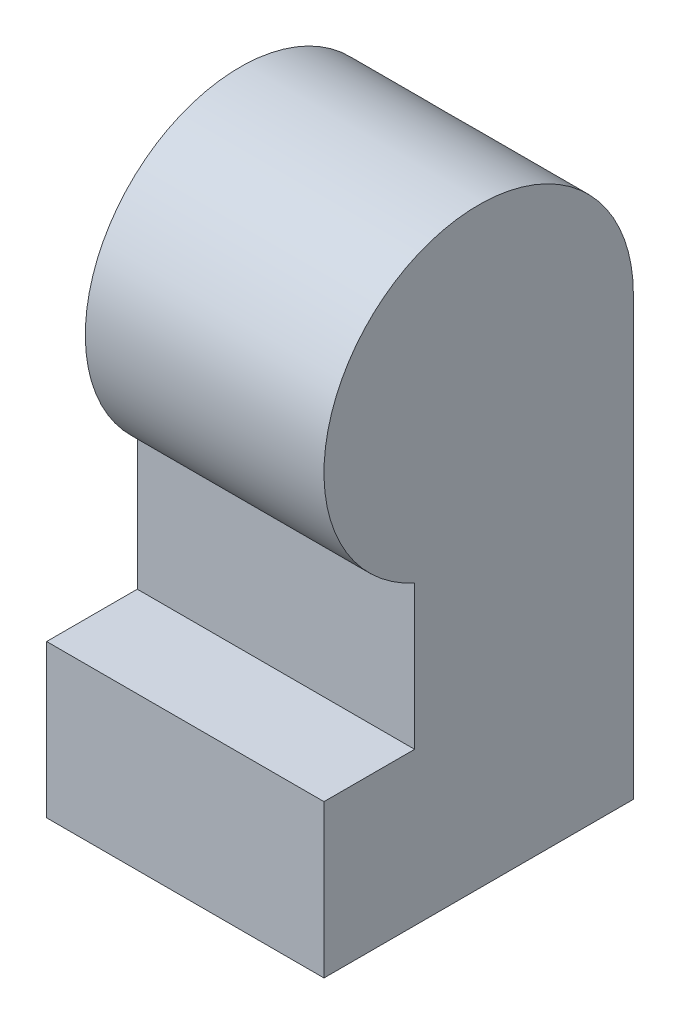
ISO-10303-21;
HEADER;
FILE_DESCRIPTION(('STEP AP214'),'2;1');
FILE_NAME('part.step','',(''),(''),'','','');
FILE_SCHEMA(('AUTOMOTIVE_DESIGN { 1 0 10303 214 1 1 1 1 }'));
ENDSEC;
DATA;
#1=APPLICATION_CONTEXT('core data for automotive mechanical design processes');
#2=APPLICATION_PROTOCOL_DEFINITION('international standard','automotive_design',2000,#1);
#3=PRODUCT_CONTEXT('',#1,'mechanical');
#4=PRODUCT('Part','Part','',(#3));
#5=PRODUCT_RELATED_PRODUCT_CATEGORY('part','',(#4));
#6=PRODUCT_DEFINITION_FORMATION('','',#4);
#7=PRODUCT_DEFINITION_CONTEXT('part definition',#1,'design');
#8=PRODUCT_DEFINITION('design','',#6,#7);
#9=PRODUCT_DEFINITION_SHAPE('','',#8);
#10=(LENGTH_UNIT() NAMED_UNIT(*) SI_UNIT(.MILLI.,.METRE.));
#11=(NAMED_UNIT(*) PLANE_ANGLE_UNIT() SI_UNIT($,.RADIAN.));
#12=(NAMED_UNIT(*) SI_UNIT($,.STERADIAN.) SOLID_ANGLE_UNIT());
#13=UNCERTAINTY_MEASURE_WITH_UNIT(LENGTH_MEASURE(1.E-05),#10,'distance_accuracy_value','');
#14=(GEOMETRIC_REPRESENTATION_CONTEXT(3) GLOBAL_UNCERTAINTY_ASSIGNED_CONTEXT((#13)) GLOBAL_UNIT_ASSIGNED_CONTEXT((#10,
#11,#12)) REPRESENTATION_CONTEXT('',''));
#15=CARTESIAN_POINT('',(0.,0.,0.));
#16=DIRECTION('',(0.,0.,1.));
#17=DIRECTION('',(1.,0.,0.));
#18=AXIS2_PLACEMENT_3D('',#15,#16,#17);
#19=CARTESIAN_POINT('',(-3.55,0.500000000000001,-2.16));
#20=DIRECTION('',(0.,0.,-1.));
#21=DIRECTION('',(0.,1.,0.));
#22=AXIS2_PLACEMENT_3D('',#19,#20,#21);
#23=PLANE('',#22);
#24=DIRECTION('',(0.,1.,0.));
#25=VECTOR('',#24,1.);
#26=CARTESIAN_POINT('',(-4.55589256539026,0.,-2.16));
#27=LINE('',#26,#25);
#28=CARTESIAN_POINT('',(-4.55589256539026,-1.67903192883735,-2.16));
#29=VERTEX_POINT('',#28);
#30=CARTESIAN_POINT('',(-4.55589256539026,2.2,-2.16));
#31=VERTEX_POINT('',#30);
#32=EDGE_CURVE('E167',#29,#31,#27,.T.);
#33=ORIENTED_EDGE('',*,*,#32,.F.);
#34=CARTESIAN_POINT('',(-3.55,0.500000000000001,-2.16));
#35=DIRECTION('',(0.,0.,-1.));
#36=DIRECTION('',(0.,1.,0.));
#37=AXIS2_PLACEMENT_3D('',#34,#35,#36);
#38=CIRCLE('',#37,2.4);
#39=CARTESIAN_POINT('',(-1.85589256539026,2.2,-2.16));
#40=VERTEX_POINT('',#39);
#41=EDGE_CURVE('E183',#29,#40,#38,.T.);
#42=ORIENTED_EDGE('',*,*,#41,.T.);
#43=DIRECTION('',(1.,0.,0.));
#44=VECTOR('',#43,1.);
#45=CARTESIAN_POINT('',(0.,2.2,-2.16));
#46=LINE('',#45,#44);
#47=EDGE_CURVE('E55',#31,#40,#46,.T.);
#48=ORIENTED_EDGE('',*,*,#47,.F.);
#49=EDGE_LOOP('',(#33,#42,#48));
#50=FACE_BOUND('',#49,.T.);
#51=ADVANCED_FACE('F37',(#50),#23,.T.);
#52=CARTESIAN_POINT('',(-7.1,-11.2,0.));
#53=DIRECTION('',(0.,1.,0.));
#54=DIRECTION('',(0.,0.,1.));
#55=AXIS2_PLACEMENT_3D('',#52,#53,#54);
#56=PLANE('',#55);
#57=DIRECTION('',(0.,0.,1.));
#58=VECTOR('',#57,1.);
#59=CARTESIAN_POINT('',(0.,-11.2,0.));
#60=LINE('',#59,#58);
#61=CARTESIAN_POINT('',(0.,-11.2,-3.96));
#62=VERTEX_POINT('',#61);
#63=CARTESIAN_POINT('',(0.,-11.2,3.96));
#64=VERTEX_POINT('',#63);
#65=EDGE_CURVE('E300',#62,#64,#60,.T.);
#66=ORIENTED_EDGE('',*,*,#65,.T.);
#67=DIRECTION('',(1.,0.,0.));
#68=VECTOR('',#67,1.);
#69=CARTESIAN_POINT('',(-7.1,-11.2,3.96));
#70=LINE('',#69,#68);
#71=CARTESIAN_POINT('',(-7.1,-11.2,3.96));
#72=VERTEX_POINT('',#71);
#73=EDGE_CURVE('E312',#72,#64,#70,.T.);
#74=ORIENTED_EDGE('',*,*,#73,.F.);
#75=DIRECTION('',(0.,0.,1.));
#76=VECTOR('',#75,1.);
#77=CARTESIAN_POINT('',(-7.1,-11.2,0.));
#78=LINE('',#77,#76);
#79=CARTESIAN_POINT('',(-7.1,-11.2,-3.96));
#80=VERTEX_POINT('',#79);
#81=EDGE_CURVE('E290',#80,#72,#78,.T.);
#82=ORIENTED_EDGE('',*,*,#81,.F.);
#83=DIRECTION('',(1.,0.,0.));
#84=VECTOR('',#83,1.);
#85=CARTESIAN_POINT('',(-7.1,-11.2,-3.96));
#86=LINE('',#85,#84);
#87=EDGE_CURVE('E309',#80,#62,#86,.T.);
#88=ORIENTED_EDGE('',*,*,#87,.T.);
#89=EDGE_LOOP('',(#66,#74,#82,#88));
#90=FACE_BOUND('',#89,.T.);
#91=DIRECTION('',(0.,0.,1.));
#92=VECTOR('',#91,1.);
#93=CARTESIAN_POINT('',(-6.05,-11.2,0.));
#94=LINE('',#93,#92);
#95=CARTESIAN_POINT('',(-6.05,-11.2,-2.44));
#96=VERTEX_POINT('',#95);
#97=CARTESIAN_POINT('',(-6.05,-11.2,2.56));
#98=VERTEX_POINT('',#97);
#99=EDGE_CURVE('E257',#96,#98,#94,.T.);
#100=ORIENTED_EDGE('',*,*,#99,.T.);
#101=DIRECTION('',(1.,0.,0.));
#102=VECTOR('',#101,1.);
#103=CARTESIAN_POINT('',(0.,-11.2,2.56));
#104=LINE('',#103,#102);
#105=CARTESIAN_POINT('',(-1.05,-11.2,2.56));
#106=VERTEX_POINT('',#105);
#107=EDGE_CURVE('E232',#98,#106,#104,.T.);
#108=ORIENTED_EDGE('',*,*,#107,.T.);
#109=DIRECTION('',(0.,0.,1.));
#110=VECTOR('',#109,1.);
#111=CARTESIAN_POINT('',(-1.05,-11.2,0.));
#112=LINE('',#111,#110);
#113=CARTESIAN_POINT('',(-1.05,-11.2,-2.44));
#114=VERTEX_POINT('',#113);
#115=EDGE_CURVE('E266',#114,#106,#112,.T.);
#116=ORIENTED_EDGE('',*,*,#115,.F.);
#117=DIRECTION('',(1.,0.,0.));
#118=VECTOR('',#117,1.);
#119=CARTESIAN_POINT('',(0.,-11.2,-2.44));
#120=LINE('',#119,#118);
#121=EDGE_CURVE('E250',#96,#114,#120,.T.);
#122=ORIENTED_EDGE('',*,*,#121,.F.);
#123=EDGE_LOOP('',(#100,#108,#116,#122));
#124=FACE_BOUND('',#123,.T.);
#125=ADVANCED_FACE('F359',(#90,#124),#56,.F.);
#126=CARTESIAN_POINT('',(0.,-2.2,0.860000000000003));
#127=DIRECTION('',(0.,0.,-1.));
#128=DIRECTION('',(0.,1.,0.));
#129=AXIS2_PLACEMENT_3D('',#126,#127,#128);
#130=PLANE('',#129);
#131=DIRECTION('',(0.,-1.,0.));
#132=VECTOR('',#131,1.);
#133=CARTESIAN_POINT('',(-1.05,-2.2,0.860000000000003));
#134=LINE('',#133,#132);
#135=CARTESIAN_POINT('',(-1.05,-2.2,0.860000000000003));
#136=VERTEX_POINT('',#135);
#137=CARTESIAN_POINT('',(-1.05,-9.2,0.86));
#138=VERTEX_POINT('',#137);
#139=EDGE_CURVE('E275',#136,#138,#134,.T.);
#140=ORIENTED_EDGE('',*,*,#139,.T.);
#141=DIRECTION('',(1.,0.,0.));
#142=VECTOR('',#141,1.);
#143=CARTESIAN_POINT('',(0.,-9.2,0.86));
#144=LINE('',#143,#142);
#145=CARTESIAN_POINT('',(-6.05,-9.2,0.86));
#146=VERTEX_POINT('',#145);
#147=EDGE_CURVE('E235',#146,#138,#144,.T.);
#148=ORIENTED_EDGE('',*,*,#147,.F.);
#149=DIRECTION('',(0.,-1.,0.));
#150=VECTOR('',#149,1.);
#151=CARTESIAN_POINT('',(-6.05,-2.2,0.860000000000003));
#152=LINE('',#151,#150);
#153=CARTESIAN_POINT('',(-6.05,-2.2,0.860000000000003));
#154=VERTEX_POINT('',#153);
#155=EDGE_CURVE('E272',#154,#146,#152,.T.);
#156=ORIENTED_EDGE('',*,*,#155,.F.);
#157=DIRECTION('',(1.,0.,0.));
#158=VECTOR('',#157,1.);
#159=CARTESIAN_POINT('',(0.,-2.2,0.860000000000003));
#160=LINE('',#159,#158);
#161=EDGE_CURVE('E260',#154,#136,#160,.T.);
#162=ORIENTED_EDGE('',*,*,#161,.T.);
#163=EDGE_LOOP('',(#140,#148,#156,#162));
#164=FACE_BOUND('',#163,.T.);
#165=ADVANCED_FACE('F355',(#164),#130,.T.);
#166=CARTESIAN_POINT('',(-6.11,0.,0.));
#167=DIRECTION('',(1.,0.,0.));
#168=DIRECTION('',(0.,0.,-1.));
#169=AXIS2_PLACEMENT_3D('',#166,#167,#168);
#170=CYLINDRICAL_SURFACE('',#169,3.96);
#171=CARTESIAN_POINT('',(-5.8973389188611,0.,-3.96));
#172=CARTESIAN_POINT('',(-5.9098768045997,0.0588098476344911,-3.96001142593905));
#173=CARTESIAN_POINT('',(-5.92018341682147,0.118093657570129,-3.95869019521766));
#174=CARTESIAN_POINT('',(-5.93631386333854,0.237132249716932,-3.95333954227172));
#175=CARTESIAN_POINT('',(-5.94213878937538,0.296886913642394,-3.94931078005181));
#176=CARTESIAN_POINT('',(-5.94927422380176,0.416126318528774,-3.93852873281473));
#177=CARTESIAN_POINT('',(-5.95060672792668,0.475610946343613,-3.93178890395762));
#178=CARTESIAN_POINT('',(-5.94888651826898,0.594135593670603,-3.91563375193332));
#179=CARTESIAN_POINT('',(-5.94583378633173,0.653175611341073,-3.90621841768981));
#180=CARTESIAN_POINT('',(-5.93025155531583,0.828925244732238,-3.87409364483853));
#181=CARTESIAN_POINT('',(-5.91130745177118,0.944432544806918,-3.84749006070398));
#182=CARTESIAN_POINT('',(-5.85772761796128,1.16917043555267,-3.78527369433188));
#183=CARTESIAN_POINT('',(-5.8230780383701,1.27839539035702,-3.74965297291276));
#184=CARTESIAN_POINT('',(-5.73761295272431,1.49425016981526,-3.66916579475425));
#185=CARTESIAN_POINT('',(-5.68603087006467,1.600427521711,-3.6239062648844));
#186=CARTESIAN_POINT('',(-5.56931231141499,1.80230489726493,-3.5278635948155));
#187=CARTESIAN_POINT('',(-5.50416685193552,1.89799791234954,-3.47707680441677));
#188=CARTESIAN_POINT('',(-5.34957245886429,2.09362962423809,-3.36350987524217));
#189=CARTESIAN_POINT('',(-5.25787033292367,2.19146366776133,-3.30017010799465));
#190=CARTESIAN_POINT('',(-5.05934205299709,2.37077502192629,-3.17380688668942));
#191=CARTESIAN_POINT('',(-4.95250717585149,2.45224283241339,-3.11078363693562));
#192=CARTESIAN_POINT('',(-4.7409667801253,2.58685104236652,-2.99938155865773));
#193=CARTESIAN_POINT('',(-4.63821091870957,2.64238802790115,-2.95020589897878));
#194=CARTESIAN_POINT('',(-4.42247423572761,2.73890332623159,-2.86082700044125));
#195=CARTESIAN_POINT('',(-4.30951430356272,2.77991057258228,-2.82060598996435));
#196=CARTESIAN_POINT('',(-4.1013322354483,2.83771311514811,-2.76229683493894));
#197=CARTESIAN_POINT('',(-4.00789408464479,2.85788974702369,-2.74125826621285));
#198=CARTESIAN_POINT('',(-3.81748707233872,2.88698351380043,-2.71060665968518));
#199=CARTESIAN_POINT('',(-3.72052353379835,2.89591695310912,-2.70097707823892));
#200=CARTESIAN_POINT('',(-3.52546248608665,2.90186254803494,-2.69459081598645));
#201=CARTESIAN_POINT('',(-3.42736228959246,2.89883523816319,-2.69787675081828));
#202=CARTESIAN_POINT('',(-3.23343630798544,2.88102900506134,-2.71687802631694));
#203=CARTESIAN_POINT('',(-3.13761312723622,2.86623723509869,-2.73260695457104));
#204=CARTESIAN_POINT('',(-2.92975894803342,2.82142079932598,-2.77892465677919));
#205=CARTESIAN_POINT('',(-2.81888224028076,2.788733657656,-2.81204600983547));
#206=CARTESIAN_POINT('',(-2.6059445652736,2.70946542950508,-2.88849841631796));
#207=CARTESIAN_POINT('',(-2.50390426441123,2.66285284931629,-2.93185256502377));
#208=CARTESIAN_POINT('',(-2.27709902374816,2.53995512114047,-3.03955495311265));
#209=CARTESIAN_POINT('',(-2.15594373839769,2.45895405274907,-3.10611055664989));
#210=CARTESIAN_POINT('',(-1.93079904919403,2.27739188823978,-3.24159983532997));
#211=CARTESIAN_POINT('',(-1.8268270546934,2.17681117680889,-3.31053583775859));
#212=CARTESIAN_POINT('',(-1.63658263891038,1.95611284262852,-3.44559774988512));
#213=CARTESIAN_POINT('',(-1.55050594124501,1.83580256142536,-3.51168689249093));
#214=CARTESIAN_POINT('',(-1.40058775471337,1.57802776944039,-3.6347921620675));
#215=CARTESIAN_POINT('',(-1.33669922855404,1.44060039698618,-3.69182734158396));
#216=CARTESIAN_POINT('',(-1.24710880306369,1.185841078758,-3.78008582227689));
#217=CARTESIAN_POINT('',(-1.21595137357599,1.07143094712434,-3.81422384051125));
#218=CARTESIAN_POINT('',(-1.17077055375075,0.836869622338844,-3.87243922554983));
#219=CARTESIAN_POINT('',(-1.15672341538163,0.716726627441237,-3.89653050597589));
#220=CARTESIAN_POINT('',(-1.14796091855799,0.496462619761133,-3.93003193715653));
#221=CARTESIAN_POINT('',(-1.1501498561578,0.396749586351458,-3.94133360872308));
#222=CARTESIAN_POINT('',(-1.16279625724436,0.247475692136995,-3.95257702124407));
#223=CARTESIAN_POINT('',(-1.16858866843412,0.1976892867594,-3.95537318999956));
#224=CARTESIAN_POINT('',(-1.1832910997067,0.0984966293703381,-3.95908660870838));
#225=CARTESIAN_POINT('',(-1.19220182296081,0.0490904656726238,-3.96000343455474));
#226=CARTESIAN_POINT('',(-1.2026610811389,0.,-3.96));
#227=B_SPLINE_CURVE_WITH_KNOTS('',3,(#171,#172,#173,#174,#175,#176,#177,#178,#179,#180,#181,
#182,#183,#184,#185,#186,#187,#188,#189,#190,#191,#192,#193,#194,#195,#196,#197,#198,#199,#200,
#201,#202,#203,#204,#205,#206,#207,#208,#209,#210,#211,#212,#213,#214,#215,#216,#217,#218,#219,
#220,#221,#222,#223,#224,#225,#226),.UNSPECIFIED.,.F.,.F.,(4,2,2,2,2,2,2,2,2,2,2,2,2,2,2,2,2,2,
2,2,2,2,2,2,2,2,2,4),(0.,0.180333838130227,0.360623732903945,0.540029602680359,0.71943621518971,
1.07774884073325,1.43637804831797,1.8142191198507,2.19231124917077,2.63548700254101,
3.07891926878974,3.45786648324535,3.83605478938871,4.12850999606934,4.42054060592625,
4.71353559853178,5.00685098024452,5.36561374202811,5.72519410272783,6.20340855129301,
6.68210457423695,7.16578873405516,7.64844116868891,8.01707795939269,8.38520251975802,
8.6852217452333,8.83570331326087,8.98621883638002),.UNSPECIFIED.);
#228=CARTESIAN_POINT('',(-5.8973389188611,0.,-3.96));
#229=VERTEX_POINT('',#228);
#230=CARTESIAN_POINT('',(-1.2026610811389,0.,-3.96));
#231=VERTEX_POINT('',#230);
#232=EDGE_CURVE('E62',#229,#231,#227,.T.);
#233=ORIENTED_EDGE('',*,*,#232,.F.);
#234=DIRECTION('',(1.,0.,0.));
#235=VECTOR('',#234,1.);
#236=CARTESIAN_POINT('',(-7.1,0.,-3.96));
#237=LINE('',#236,#235);
#238=CARTESIAN_POINT('',(-6.11,0.,-3.96));
#239=VERTEX_POINT('',#238);
#240=EDGE_CURVE('E307',#239,#229,#237,.T.);
#241=ORIENTED_EDGE('',*,*,#240,.F.);
#242=CARTESIAN_POINT('',(-6.11,0.,0.));
#243=DIRECTION('',(1.,0.,0.));
#244=DIRECTION('',(0.,0.,-1.));
#245=AXIS2_PLACEMENT_3D('',#242,#243,#244);
#246=CIRCLE('',#245,3.96);
#247=CARTESIAN_POINT('',(-6.11,-3.60444170434202,1.64));
#248=VERTEX_POINT('',#247);
#249=EDGE_CURVE('E12',#239,#248,#246,.T.);
#250=ORIENTED_EDGE('',*,*,#249,.T.);
#251=DIRECTION('',(1.,0.,0.));
#252=VECTOR('',#251,1.);
#253=CARTESIAN_POINT('',(-7.1,-3.60444170434202,1.64));
#254=LINE('',#253,#252);
#255=CARTESIAN_POINT('',(0.,-3.60444170434202,1.64));
#256=VERTEX_POINT('',#255);
#257=EDGE_CURVE('E294',#248,#256,#254,.T.);
#258=ORIENTED_EDGE('',*,*,#257,.T.);
#259=CARTESIAN_POINT('',(0.,0.,0.));
#260=DIRECTION('',(1.,0.,0.));
#261=DIRECTION('',(0.,0.,-1.));
#262=AXIS2_PLACEMENT_3D('',#259,#260,#261);
#263=CIRCLE('',#262,3.96);
#264=CARTESIAN_POINT('',(0.,0.,-3.96));
#265=VERTEX_POINT('',#264);
#266=EDGE_CURVE('E47',#265,#256,#263,.T.);
#267=ORIENTED_EDGE('',*,*,#266,.F.);
#268=EDGE_CURVE('E308',#231,#265,#237,.T.);
#269=ORIENTED_EDGE('',*,*,#268,.F.);
#270=EDGE_LOOP('',(#233,#241,#250,#258,#267,#269));
#271=FACE_BOUND('',#270,.T.);
#272=ADVANCED_FACE('F39',(#271),#170,.T.);
#273=CARTESIAN_POINT('',(-6.11,0.,0.));
#274=DIRECTION('',(1.,0.,0.));
#275=DIRECTION('',(0.,0.,-1.));
#276=AXIS2_PLACEMENT_3D('',#273,#274,#275);
#277=PLANE('',#276);
#278=CARTESIAN_POINT('',(-6.11,0.,0.));
#279=DIRECTION('',(-1.,0.,0.));
#280=DIRECTION('',(0.,0.,1.));
#281=AXIS2_PLACEMENT_3D('',#278,#279,#280);
#282=CIRCLE('',#281,1.125);
#283=CARTESIAN_POINT('',(-6.11,0.,1.125));
#284=VERTEX_POINT('',#283);
#285=EDGE_CURVE('E185',#284,#284,#282,.T.);
#286=ORIENTED_EDGE('',*,*,#285,.F.);
#287=EDGE_LOOP('',(#286));
#288=FACE_BOUND('',#287,.T.);
#289=ORIENTED_EDGE('',*,*,#249,.F.);
#290=CARTESIAN_POINT('',(-6.11,0.,0.));
#291=DIRECTION('',(1.,0.,0.));
#292=DIRECTION('',(0.,0.,-1.));
#293=AXIS2_PLACEMENT_3D('',#290,#291,#292);
#294=CIRCLE('',#293,3.96);
#295=EDGE_CURVE('E306',#248,#239,#294,.T.);
#296=ORIENTED_EDGE('',*,*,#295,.F.);
#297=EDGE_LOOP('',(#289,#296));
#298=FACE_BOUND('',#297,.T.);
#299=ADVANCED_FACE('F347',(#288,#298),#277,.F.);
#300=CARTESIAN_POINT('',(0.,0.,0.));
#301=DIRECTION('',(1.,0.,0.));
#302=DIRECTION('',(0.,0.,-1.));
#303=AXIS2_PLACEMENT_3D('',#300,#301,#302);
#304=PLANE('',#303);
#305=ORIENTED_EDGE('',*,*,#266,.T.);
#306=DIRECTION('',(0.,1.,0.));
#307=VECTOR('',#306,1.);
#308=CARTESIAN_POINT('',(0.,0.,1.64));
#309=LINE('',#308,#307);
#310=CARTESIAN_POINT('',(0.,-7.29,1.64));
#311=VERTEX_POINT('',#310);
#312=EDGE_CURVE('E271',#311,#256,#309,.T.);
#313=ORIENTED_EDGE('',*,*,#312,.F.);
#314=DIRECTION('',(0.,0.,-1.));
#315=VECTOR('',#314,1.);
#316=CARTESIAN_POINT('',(0.,-7.29,0.));
#317=LINE('',#316,#315);
#318=CARTESIAN_POINT('',(0.,-7.29,3.96));
#319=VERTEX_POINT('',#318);
#320=EDGE_CURVE('E296',#319,#311,#317,.T.);
#321=ORIENTED_EDGE('',*,*,#320,.F.);
#322=DIRECTION('',(0.,1.,0.));
#323=VECTOR('',#322,1.);
#324=CARTESIAN_POINT('',(0.,0.,3.96));
#325=LINE('',#324,#323);
#326=EDGE_CURVE('E298',#64,#319,#325,.T.);
#327=ORIENTED_EDGE('',*,*,#326,.F.);
#328=ORIENTED_EDGE('',*,*,#65,.F.);
#329=DIRECTION('',(0.,-1.,0.));
#330=VECTOR('',#329,1.);
#331=CARTESIAN_POINT('',(0.,0.,-3.96));
#332=LINE('',#331,#330);
#333=EDGE_CURVE('E284',#265,#62,#332,.T.);
#334=ORIENTED_EDGE('',*,*,#333,.F.);
#335=EDGE_LOOP('',(#305,#313,#321,#327,#328,#334));
#336=FACE_BOUND('',#335,.T.);
#337=ADVANCED_FACE('F329',(#336),#304,.T.);
#338=CARTESIAN_POINT('',(-7.1,0.,0.));
#339=DIRECTION('',(1.,0.,0.));
#340=DIRECTION('',(0.,0.,-1.));
#341=AXIS2_PLACEMENT_3D('',#338,#339,#340);
#342=CYLINDRICAL_SURFACE('',#341,3.96);
#343=CARTESIAN_POINT('',(-7.1,-3.60444170434202,1.64));
#344=VERTEX_POINT('',#343);
#345=EDGE_CURVE('E321',#344,#248,#254,.T.);
#346=ORIENTED_EDGE('',*,*,#345,.T.);
#347=ORIENTED_EDGE('',*,*,#295,.T.);
#348=CARTESIAN_POINT('',(-7.1,0.,-3.96));
#349=VERTEX_POINT('',#348);
#350=EDGE_CURVE('E303',#349,#239,#237,.T.);
#351=ORIENTED_EDGE('',*,*,#350,.F.);
#352=CARTESIAN_POINT('',(-7.1,0.,0.));
#353=DIRECTION('',(1.,0.,0.));
#354=DIRECTION('',(0.,0.,-1.));
#355=AXIS2_PLACEMENT_3D('',#352,#353,#354);
#356=CIRCLE('',#355,3.96);
#357=EDGE_CURVE('E280',#344,#349,#356,.T.);
#358=ORIENTED_EDGE('',*,*,#357,.F.);
#359=EDGE_LOOP('',(#346,#347,#351,#358));
#360=FACE_BOUND('',#359,.T.);
#361=ADVANCED_FACE('F344',(#360),#342,.F.);
#362=CARTESIAN_POINT('',(-7.1,0.,-3.96));
#363=DIRECTION('',(0.,0.,1.));
#364=DIRECTION('',(0.,-1.,0.));
#365=AXIS2_PLACEMENT_3D('',#362,#363,#364);
#366=PLANE('',#365);
#367=CARTESIAN_POINT('',(-3.55,-7.3,-3.96));
#368=DIRECTION('',(0.,0.,-1.));
#369=DIRECTION('',(0.,1.,0.));
#370=AXIS2_PLACEMENT_3D('',#367,#368,#369);
#371=CIRCLE('',#370,2.4);
#372=CARTESIAN_POINT('',(-3.55,-4.9,-3.96));
#373=VERTEX_POINT('',#372);
#374=EDGE_CURVE('E233',#373,#373,#371,.T.);
#375=ORIENTED_EDGE('',*,*,#374,.F.);
#376=EDGE_LOOP('',(#375));
#377=FACE_BOUND('',#376,.T.);
#378=ORIENTED_EDGE('',*,*,#240,.T.);
#379=CARTESIAN_POINT('',(-3.55,0.500000000000001,-3.96));
#380=DIRECTION('',(0.,0.,-1.));
#381=DIRECTION('',(0.,1.,0.));
#382=AXIS2_PLACEMENT_3D('',#379,#380,#381);
#383=CIRCLE('',#382,2.4);
#384=EDGE_CURVE('E396',#231,#229,#383,.T.);
#385=ORIENTED_EDGE('',*,*,#384,.F.);
#386=ORIENTED_EDGE('',*,*,#268,.T.);
#387=ORIENTED_EDGE('',*,*,#333,.T.);
#388=ORIENTED_EDGE('',*,*,#87,.F.);
#389=DIRECTION('',(0.,-1.,0.));
#390=VECTOR('',#389,1.);
#391=CARTESIAN_POINT('',(-7.1,0.,-3.96));
#392=LINE('',#391,#390);
#393=EDGE_CURVE('E292',#349,#80,#392,.T.);
#394=ORIENTED_EDGE('',*,*,#393,.F.);
#395=ORIENTED_EDGE('',*,*,#350,.T.);
#396=EDGE_LOOP('',(#378,#385,#386,#387,#388,#394,#395));
#397=FACE_BOUND('',#396,.T.);
#398=ADVANCED_FACE('F373',(#377,#397),#366,.F.);
#399=CARTESIAN_POINT('',(-7.1,0.,3.96));
#400=DIRECTION('',(0.,0.,-1.));
#401=DIRECTION('',(0.,1.,0.));
#402=AXIS2_PLACEMENT_3D('',#399,#400,#401);
#403=PLANE('',#402);
#404=ORIENTED_EDGE('',*,*,#326,.T.);
#405=DIRECTION('',(1.,0.,0.));
#406=VECTOR('',#405,1.);
#407=CARTESIAN_POINT('',(-7.1,-7.29,3.96));
#408=LINE('',#407,#406);
#409=CARTESIAN_POINT('',(-7.1,-7.29,3.96));
#410=VERTEX_POINT('',#409);
#411=EDGE_CURVE('E315',#410,#319,#408,.T.);
#412=ORIENTED_EDGE('',*,*,#411,.F.);
#413=DIRECTION('',(0.,1.,0.));
#414=VECTOR('',#413,1.);
#415=CARTESIAN_POINT('',(-7.1,0.,3.96));
#416=LINE('',#415,#414);
#417=EDGE_CURVE('E288',#72,#410,#416,.T.);
#418=ORIENTED_EDGE('',*,*,#417,.F.);
#419=ORIENTED_EDGE('',*,*,#73,.T.);
#420=EDGE_LOOP('',(#404,#412,#418,#419));
#421=FACE_BOUND('',#420,.T.);
#422=ADVANCED_FACE('F375',(#421),#403,.F.);
#423=CARTESIAN_POINT('',(-7.1,-7.29,0.));
#424=DIRECTION('',(0.,-1.,0.));
#425=DIRECTION('',(0.,0.,-1.));
#426=AXIS2_PLACEMENT_3D('',#423,#424,#425);
#427=PLANE('',#426);
#428=ORIENTED_EDGE('',*,*,#320,.T.);
#429=DIRECTION('',(1.,0.,0.));
#430=VECTOR('',#429,1.);
#431=CARTESIAN_POINT('',(-7.1,-7.29,1.64));
#432=LINE('',#431,#430);
#433=CARTESIAN_POINT('',(-7.1,-7.29,1.64));
#434=VERTEX_POINT('',#433);
#435=EDGE_CURVE('E318',#434,#311,#432,.T.);
#436=ORIENTED_EDGE('',*,*,#435,.F.);
#437=DIRECTION('',(0.,0.,-1.));
#438=VECTOR('',#437,1.);
#439=CARTESIAN_POINT('',(-7.1,-7.29,0.));
#440=LINE('',#439,#438);
#441=EDGE_CURVE('E286',#410,#434,#440,.T.);
#442=ORIENTED_EDGE('',*,*,#441,.F.);
#443=ORIENTED_EDGE('',*,*,#411,.T.);
#444=EDGE_LOOP('',(#428,#436,#442,#443));
#445=FACE_BOUND('',#444,.T.);
#446=ADVANCED_FACE('F378',(#445),#427,.F.);
#447=CARTESIAN_POINT('',(-7.1,0.,1.64));
#448=DIRECTION('',(0.,0.,-1.));
#449=DIRECTION('',(0.,1.,0.));
#450=AXIS2_PLACEMENT_3D('',#447,#448,#449);
#451=PLANE('',#450);
#452=ORIENTED_EDGE('',*,*,#312,.T.);
#453=ORIENTED_EDGE('',*,*,#257,.F.);
#454=ORIENTED_EDGE('',*,*,#345,.F.);
#455=DIRECTION('',(0.,1.,0.));
#456=VECTOR('',#455,1.);
#457=CARTESIAN_POINT('',(-7.1,0.,1.64));
#458=LINE('',#457,#456);
#459=EDGE_CURVE('E283',#434,#344,#458,.T.);
#460=ORIENTED_EDGE('',*,*,#459,.F.);
#461=ORIENTED_EDGE('',*,*,#435,.T.);
#462=EDGE_LOOP('',(#452,#453,#454,#460,#461));
#463=FACE_BOUND('',#462,.T.);
#464=ADVANCED_FACE('F339',(#463),#451,.F.);
#465=CARTESIAN_POINT('',(-7.1,0.,0.));
#466=DIRECTION('',(1.,0.,0.));
#467=DIRECTION('',(0.,0.,-1.));
#468=AXIS2_PLACEMENT_3D('',#465,#466,#467);
#469=PLANE('',#468);
#470=ORIENTED_EDGE('',*,*,#357,.T.);
#471=ORIENTED_EDGE('',*,*,#393,.T.);
#472=ORIENTED_EDGE('',*,*,#81,.T.);
#473=ORIENTED_EDGE('',*,*,#417,.T.);
#474=ORIENTED_EDGE('',*,*,#441,.T.);
#475=ORIENTED_EDGE('',*,*,#459,.T.);
#476=EDGE_LOOP('',(#470,#471,#472,#473,#474,#475));
#477=FACE_BOUND('',#476,.T.);
#478=ADVANCED_FACE('F384',(#477),#469,.F.);
#479=CARTESIAN_POINT('',(0.,-2.2,-2.44));
#480=DIRECTION('',(0.,0.,-1.));
#481=DIRECTION('',(0.,1.,0.));
#482=AXIS2_PLACEMENT_3D('',#479,#480,#481);
#483=PLANE('',#482);
#484=CARTESIAN_POINT('',(-3.55,-7.3,-2.44));
#485=DIRECTION('',(0.,0.,-1.));
#486=DIRECTION('',(0.,1.,0.));
#487=AXIS2_PLACEMENT_3D('',#484,#485,#486);
#488=CIRCLE('',#487,2.4);
#489=CARTESIAN_POINT('',(-3.55,-4.9,-2.44));
#490=VERTEX_POINT('',#489);
#491=EDGE_CURVE('E42',#490,#490,#488,.T.);
#492=ORIENTED_EDGE('',*,*,#491,.T.);
#493=EDGE_LOOP('',(#492));
#494=FACE_BOUND('',#493,.T.);
#495=ORIENTED_EDGE('',*,*,#121,.T.);
#496=DIRECTION('',(0.,-1.,0.));
#497=VECTOR('',#496,1.);
#498=CARTESIAN_POINT('',(-1.05,-2.2,-2.44));
#499=LINE('',#498,#497);
#500=CARTESIAN_POINT('',(-1.05,-2.2,-2.44));
#501=VERTEX_POINT('',#500);
#502=EDGE_CURVE('E264',#501,#114,#499,.T.);
#503=ORIENTED_EDGE('',*,*,#502,.F.);
#504=DIRECTION('',(1.,0.,0.));
#505=VECTOR('',#504,1.);
#506=CARTESIAN_POINT('',(0.,-2.2,-2.44));
#507=LINE('',#506,#505);
#508=CARTESIAN_POINT('',(-6.05,-2.2,-2.44));
#509=VERTEX_POINT('',#508);
#510=EDGE_CURVE('E253',#509,#501,#507,.T.);
#511=ORIENTED_EDGE('',*,*,#510,.F.);
#512=DIRECTION('',(0.,-1.,0.));
#513=VECTOR('',#512,1.);
#514=CARTESIAN_POINT('',(-6.05,-2.2,-2.44));
#515=LINE('',#514,#513);
#516=EDGE_CURVE('E269',#509,#96,#515,.T.);
#517=ORIENTED_EDGE('',*,*,#516,.T.);
#518=EDGE_LOOP('',(#495,#503,#511,#517));
#519=FACE_BOUND('',#518,.T.);
#520=ADVANCED_FACE('F407',(#494,#519),#483,.F.);
#521=CARTESIAN_POINT('',(-6.05,-2.2,0.));
#522=DIRECTION('',(1.,0.,0.));
#523=DIRECTION('',(0.,0.,-1.));
#524=AXIS2_PLACEMENT_3D('',#521,#522,#523);
#525=PLANE('',#524);
#526=ORIENTED_EDGE('',*,*,#99,.F.);
#527=ORIENTED_EDGE('',*,*,#516,.F.);
#528=DIRECTION('',(0.,0.,1.));
#529=VECTOR('',#528,1.);
#530=CARTESIAN_POINT('',(-6.05,-2.2,0.));
#531=LINE('',#530,#529);
#532=EDGE_CURVE('E262',#509,#154,#531,.T.);
#533=ORIENTED_EDGE('',*,*,#532,.T.);
#534=ORIENTED_EDGE('',*,*,#155,.T.);
#535=DIRECTION('',(0.,0.,1.));
#536=VECTOR('',#535,1.);
#537=CARTESIAN_POINT('',(-6.05,-9.2,0.));
#538=LINE('',#537,#536);
#539=CARTESIAN_POINT('',(-6.05,-9.2,2.56));
#540=VERTEX_POINT('',#539);
#541=EDGE_CURVE('E242',#146,#540,#538,.T.);
#542=ORIENTED_EDGE('',*,*,#541,.T.);
#543=DIRECTION('',(0.,-1.,0.));
#544=VECTOR('',#543,1.);
#545=CARTESIAN_POINT('',(-6.05,-9.2,2.56));
#546=LINE('',#545,#544);
#547=EDGE_CURVE('E247',#540,#98,#546,.T.);
#548=ORIENTED_EDGE('',*,*,#547,.T.);
#549=EDGE_LOOP('',(#526,#527,#533,#534,#542,#548));
#550=FACE_BOUND('',#549,.T.);
#551=ADVANCED_FACE('F411',(#550),#525,.T.);
#552=CARTESIAN_POINT('',(-1.05,-2.2,0.));
#553=DIRECTION('',(1.,0.,0.));
#554=DIRECTION('',(0.,0.,-1.));
#555=AXIS2_PLACEMENT_3D('',#552,#553,#554);
#556=PLANE('',#555);
#557=ORIENTED_EDGE('',*,*,#115,.T.);
#558=DIRECTION('',(0.,-1.,0.));
#559=VECTOR('',#558,1.);
#560=CARTESIAN_POINT('',(-1.05,-9.2,2.56));
#561=LINE('',#560,#559);
#562=CARTESIAN_POINT('',(-1.05,-9.2,2.56));
#563=VERTEX_POINT('',#562);
#564=EDGE_CURVE('E244',#563,#106,#561,.T.);
#565=ORIENTED_EDGE('',*,*,#564,.F.);
#566=DIRECTION('',(0.,0.,1.));
#567=VECTOR('',#566,1.);
#568=CARTESIAN_POINT('',(-1.05,-9.2,0.));
#569=LINE('',#568,#567);
#570=EDGE_CURVE('E237',#138,#563,#569,.T.);
#571=ORIENTED_EDGE('',*,*,#570,.F.);
#572=ORIENTED_EDGE('',*,*,#139,.F.);
#573=DIRECTION('',(0.,0.,1.));
#574=VECTOR('',#573,1.);
#575=CARTESIAN_POINT('',(-1.05,-2.2,0.));
#576=LINE('',#575,#574);
#577=EDGE_CURVE('E256',#501,#136,#576,.T.);
#578=ORIENTED_EDGE('',*,*,#577,.F.);
#579=ORIENTED_EDGE('',*,*,#502,.T.);
#580=EDGE_LOOP('',(#557,#565,#571,#572,#578,#579));
#581=FACE_BOUND('',#580,.T.);
#582=ADVANCED_FACE('F415',(#581),#556,.F.);
#583=CARTESIAN_POINT('',(0.,-2.2,0.));
#584=DIRECTION('',(0.,-1.,0.));
#585=DIRECTION('',(0.,0.,-1.));
#586=AXIS2_PLACEMENT_3D('',#583,#584,#585);
#587=PLANE('',#586);
#588=ORIENTED_EDGE('',*,*,#510,.T.);
#589=ORIENTED_EDGE('',*,*,#577,.T.);
#590=ORIENTED_EDGE('',*,*,#161,.F.);
#591=ORIENTED_EDGE('',*,*,#532,.F.);
#592=EDGE_LOOP('',(#588,#589,#590,#591));
#593=FACE_BOUND('',#592,.T.);
#594=ADVANCED_FACE('F417',(#593),#587,.T.);
#595=CARTESIAN_POINT('',(0.,-9.2,2.56));
#596=DIRECTION('',(0.,0.,-1.));
#597=DIRECTION('',(0.,1.,0.));
#598=AXIS2_PLACEMENT_3D('',#595,#596,#597);
#599=PLANE('',#598);
#600=ORIENTED_EDGE('',*,*,#107,.F.);
#601=ORIENTED_EDGE('',*,*,#547,.F.);
#602=DIRECTION('',(1.,0.,0.));
#603=VECTOR('',#602,1.);
#604=CARTESIAN_POINT('',(0.,-9.2,2.56));
#605=LINE('',#604,#603);
#606=EDGE_CURVE('E240',#540,#563,#605,.T.);
#607=ORIENTED_EDGE('',*,*,#606,.T.);
#608=ORIENTED_EDGE('',*,*,#564,.T.);
#609=EDGE_LOOP('',(#600,#601,#607,#608));
#610=FACE_BOUND('',#609,.T.);
#611=ADVANCED_FACE('F425',(#610),#599,.T.);
#612=CARTESIAN_POINT('',(0.,-9.2,0.));
#613=DIRECTION('',(0.,-1.,0.));
#614=DIRECTION('',(0.,0.,-1.));
#615=AXIS2_PLACEMENT_3D('',#612,#613,#614);
#616=PLANE('',#615);
#617=ORIENTED_EDGE('',*,*,#147,.T.);
#618=ORIENTED_EDGE('',*,*,#570,.T.);
#619=ORIENTED_EDGE('',*,*,#606,.F.);
#620=ORIENTED_EDGE('',*,*,#541,.F.);
#621=EDGE_LOOP('',(#617,#618,#619,#620));
#622=FACE_BOUND('',#621,.T.);
#623=ADVANCED_FACE('F428',(#622),#616,.T.);
#624=CARTESIAN_POINT('',(-3.55,-7.3,-2.16));
#625=DIRECTION('',(0.,0.,-1.));
#626=DIRECTION('',(0.,1.,0.));
#627=AXIS2_PLACEMENT_3D('',#624,#625,#626);
#628=CYLINDRICAL_SURFACE('',#627,2.4);
#629=ORIENTED_EDGE('',*,*,#374,.T.);
#630=EDGE_LOOP('',(#629));
#631=FACE_BOUND('',#630,.T.);
#632=ORIENTED_EDGE('',*,*,#491,.F.);
#633=EDGE_LOOP('',(#632));
#634=FACE_BOUND('',#633,.T.);
#635=ADVANCED_FACE('F223',(#631,#634),#628,.F.);
#636=CARTESIAN_POINT('',(-3.55,0.500000000000001,-2.16));
#637=DIRECTION('',(0.,0.,-1.));
#638=DIRECTION('',(0.,1.,0.));
#639=AXIS2_PLACEMENT_3D('',#636,#637,#638);
#640=CYLINDRICAL_SURFACE('',#639,2.4);
#641=ORIENTED_EDGE('',*,*,#232,.T.);
#642=ORIENTED_EDGE('',*,*,#384,.T.);
#643=EDGE_LOOP('',(#641,#642));
#644=FACE_BOUND('',#643,.T.);
#645=CARTESIAN_POINT('',(-1.85589256539026,-1.2,-2.16));
#646=VERTEX_POINT('',#645);
#647=EDGE_CURVE('E457',#40,#646,#38,.T.);
#648=ORIENTED_EDGE('',*,*,#647,.F.);
#649=ORIENTED_EDGE('',*,*,#41,.F.);
#650=DIRECTION('',(0.,0.,-1.));
#651=VECTOR('',#650,1.);
#652=CARTESIAN_POINT('',(-4.55589256539026,-1.67903192883735,6.361));
#653=LINE('',#652,#651);
#654=CARTESIAN_POINT('',(-4.55589256539026,-1.67903192883735,2.19053687071109));
#655=VERTEX_POINT('',#654);
#656=EDGE_CURVE('E172',#655,#29,#653,.T.);
#657=ORIENTED_EDGE('',*,*,#656,.F.);
#658=CARTESIAN_POINT('',(-1.85589256539026,-1.2,2.48547782126496));
#659=CARTESIAN_POINT('',(-1.90428508170741,-1.24821126948293,2.46220724164314));
#660=CARTESIAN_POINT('',(-1.95455131041917,-1.29419913814187,2.43826859893972));
#661=CARTESIAN_POINT('',(-2.05866827545539,-1.38163909153082,2.38980449291007));
#662=CARTESIAN_POINT('',(-2.11252066486145,-1.42308906086031,2.36527876234249));
#663=CARTESIAN_POINT('',(-2.22415480175121,-1.50170875666118,2.31616951299939));
#664=CARTESIAN_POINT('',(-2.28197033607853,-1.53883175309266,2.29158785054146));
#665=CARTESIAN_POINT('',(-2.40087625399385,-1.60813935754813,2.24349460000214));
#666=CARTESIAN_POINT('',(-2.46196577882249,-1.6403252520895,2.21998273427859));
#667=CARTESIAN_POINT('',(-2.62571830265247,-1.71769975392668,2.1611791307396));
#668=CARTESIAN_POINT('',(-2.73095678636568,-1.75880151048349,2.12747756256989));
#669=CARTESIAN_POINT('',(-2.94828911526955,-1.82611486738747,2.06999481985717));
#670=CARTESIAN_POINT('',(-3.06035243669158,-1.85238804608171,2.04617273004841));
#671=CARTESIAN_POINT('',(-3.2906982561067,-1.88882231646786,2.01261355413653));
#672=CARTESIAN_POINT('',(-3.40903868955286,-1.89878891067868,2.00304661535349));
#673=CARTESIAN_POINT('',(-3.64610630928749,-1.9010015037771,2.00095048892548));
#674=CARTESIAN_POINT('',(-3.76483361197897,-1.89324155813602,2.00842701674137));
#675=CARTESIAN_POINT('',(-3.97919188434537,-1.86339180572531,2.03609215166128));
#676=CARTESIAN_POINT('',(-4.07549143310836,-1.84377913604158,2.05406826927214));
#677=CARTESIAN_POINT('',(-4.26320624152071,-1.79363696267328,2.09799195787907));
#678=CARTESIAN_POINT('',(-4.35462329420714,-1.76311149870717,2.12393657857985));
#679=CARTESIAN_POINT('',(-4.48128253278282,-1.71232967473933,2.16469687256919));
#680=CARTESIAN_POINT('',(-4.51887326081246,-1.6961221869477,2.17743826557419));
#681=CARTESIAN_POINT('',(-4.55589256539024,-1.67903192883743,2.19053687071123));
#682=B_SPLINE_CURVE_WITH_KNOTS('',3,(#658,#659,#660,#661,#662,#663,#664,#665,#666,#667,#668,
#669,#670,#671,#672,#673,#674,#675,#676,#677,#678,#679,#680,#681),.UNSPECIFIED.,.F.,.F.,(4,2,2,
2,2,2,2,2,2,2,2,4),(0.,0.21641159385025,0.432923645021216,0.651591601469976,0.870202479942214,
1.22251601410764,1.57335553008861,1.92834997654107,2.28346348652555,2.58206088902257,
2.88054787044093,3.00908556343134),.UNSPECIFIED.);
#683=CARTESIAN_POINT('',(-1.85589256539026,-1.2,2.48547782126496));
#684=VERTEX_POINT('',#683);
#685=EDGE_CURVE('E196',#684,#655,#682,.T.);
#686=ORIENTED_EDGE('',*,*,#685,.F.);
#687=DIRECTION('',(0.,0.,-1.));
#688=VECTOR('',#687,1.);
#689=CARTESIAN_POINT('',(-1.85589256539026,-1.2,6.361));
#690=LINE('',#689,#688);
#691=EDGE_CURVE('E205',#684,#646,#690,.T.);
#692=ORIENTED_EDGE('',*,*,#691,.T.);
#693=EDGE_LOOP('',(#648,#649,#657,#686,#692));
#694=FACE_BOUND('',#693,.T.);
#695=ADVANCED_FACE('F218',(#644,#694),#640,.F.);
#696=DIRECTION('',(0.,-1.,0.));
#697=VECTOR('',#696,1.);
#698=CARTESIAN_POINT('',(-1.85589256539026,0.,-2.16));
#699=LINE('',#698,#697);
#700=EDGE_CURVE('E176',#40,#646,#699,.T.);
#701=ORIENTED_EDGE('',*,*,#700,.F.);
#702=ORIENTED_EDGE('',*,*,#647,.T.);
#703=EDGE_LOOP('',(#701,#702));
#704=FACE_BOUND('',#703,.T.);
#705=ADVANCED_FACE('F214',(#704),#23,.T.);
#706=CARTESIAN_POINT('',(-6.11,0.,0.));
#707=DIRECTION('',(1.,0.,0.));
#708=DIRECTION('',(0.,0.,-1.));
#709=AXIS2_PLACEMENT_3D('',#706,#707,#708);
#710=CYLINDRICAL_SURFACE('',#709,2.76);
#711=DIRECTION('',(1.,0.,0.));
#712=VECTOR('',#711,1.);
#713=CARTESIAN_POINT('',(-6.11,2.2,1.66661333247997));
#714=LINE('',#713,#712);
#715=CARTESIAN_POINT('',(-4.55589256539026,2.2,1.66661333247997));
#716=VERTEX_POINT('',#715);
#717=CARTESIAN_POINT('',(-1.85589256539026,2.2,1.66661333247997));
#718=VERTEX_POINT('',#717);
#719=EDGE_CURVE('E180',#716,#718,#714,.T.);
#720=ORIENTED_EDGE('',*,*,#719,.T.);
#721=CARTESIAN_POINT('',(-1.85589256539026,0.,0.));
#722=DIRECTION('',(1.,0.,0.));
#723=DIRECTION('',(0.,1.,0.));
#724=AXIS2_PLACEMENT_3D('',#721,#722,#723);
#725=CIRCLE('',#724,2.76);
#726=EDGE_CURVE('E194',#718,#684,#725,.T.);
#727=ORIENTED_EDGE('',*,*,#726,.T.);
#728=ORIENTED_EDGE('',*,*,#685,.T.);
#729=CARTESIAN_POINT('',(-4.55589256539026,0.,0.));
#730=DIRECTION('',(-1.,0.,0.));
#731=DIRECTION('',(0.,0.,1.));
#732=AXIS2_PLACEMENT_3D('',#729,#730,#731);
#733=CIRCLE('',#732,2.76);
#734=EDGE_CURVE('E181',#655,#716,#733,.T.);
#735=ORIENTED_EDGE('',*,*,#734,.T.);
#736=EDGE_LOOP('',(#720,#727,#728,#735));
#737=FACE_BOUND('',#736,.T.);
#738=ADVANCED_FACE('F209',(#737),#710,.F.);
#739=CARTESIAN_POINT('',(-1.85589256539026,0.,6.361));
#740=DIRECTION('',(1.,0.,0.));
#741=DIRECTION('',(0.,1.,0.));
#742=AXIS2_PLACEMENT_3D('',#739,#740,#741);
#743=PLANE('',#742);
#744=DIRECTION('',(0.,0.,-1.));
#745=VECTOR('',#744,1.);
#746=CARTESIAN_POINT('',(-1.85589256539026,2.2,6.361));
#747=LINE('',#746,#745);
#748=EDGE_CURVE('E462',#718,#40,#747,.T.);
#749=ORIENTED_EDGE('',*,*,#748,.T.);
#750=ORIENTED_EDGE('',*,*,#700,.T.);
#751=ORIENTED_EDGE('',*,*,#691,.F.);
#752=ORIENTED_EDGE('',*,*,#726,.F.);
#753=EDGE_LOOP('',(#749,#750,#751,#752));
#754=FACE_BOUND('',#753,.T.);
#755=ADVANCED_FACE('F213',(#754),#743,.F.);
#756=CARTESIAN_POINT('',(-4.55589256539026,0.,6.361));
#757=DIRECTION('',(-1.,0.,0.));
#758=DIRECTION('',(0.,0.,1.));
#759=AXIS2_PLACEMENT_3D('',#756,#757,#758);
#760=PLANE('',#759);
#761=CARTESIAN_POINT('',(-4.55589256539026,0.,0.));
#762=DIRECTION('',(-1.,0.,0.));
#763=DIRECTION('',(0.,0.,1.));
#764=AXIS2_PLACEMENT_3D('',#761,#762,#763);
#765=CIRCLE('',#764,1.125);
#766=CARTESIAN_POINT('',(-4.55589256539026,0.,1.125));
#767=VERTEX_POINT('',#766);
#768=EDGE_CURVE('E188',#767,#767,#765,.F.);
#769=ORIENTED_EDGE('',*,*,#768,.F.);
#770=EDGE_LOOP('',(#769));
#771=FACE_BOUND('',#770,.T.);
#772=DIRECTION('',(0.,0.,-1.));
#773=VECTOR('',#772,1.);
#774=CARTESIAN_POINT('',(-4.55589256539026,2.2,6.361));
#775=LINE('',#774,#773);
#776=EDGE_CURVE('E169',#716,#31,#775,.T.);
#777=ORIENTED_EDGE('',*,*,#776,.F.);
#778=ORIENTED_EDGE('',*,*,#734,.F.);
#779=ORIENTED_EDGE('',*,*,#656,.T.);
#780=ORIENTED_EDGE('',*,*,#32,.T.);
#781=EDGE_LOOP('',(#777,#778,#779,#780));
#782=FACE_BOUND('',#781,.T.);
#783=ADVANCED_FACE('F168',(#771,#782),#760,.F.);
#784=CARTESIAN_POINT('',(0.,2.2,6.361));
#785=DIRECTION('',(0.,1.,0.));
#786=DIRECTION('',(0.,0.,1.));
#787=AXIS2_PLACEMENT_3D('',#784,#785,#786);
#788=PLANE('',#787);
#789=ORIENTED_EDGE('',*,*,#776,.T.);
#790=ORIENTED_EDGE('',*,*,#47,.T.);
#791=ORIENTED_EDGE('',*,*,#748,.F.);
#792=ORIENTED_EDGE('',*,*,#719,.F.);
#793=EDGE_LOOP('',(#789,#790,#791,#792));
#794=FACE_BOUND('',#793,.T.);
#795=ADVANCED_FACE('F178',(#794),#788,.F.);
#796=CARTESIAN_POINT('',(0.00100000000000013,0.,0.));
#797=DIRECTION('',(-1.,0.,0.));
#798=DIRECTION('',(0.,0.,1.));
#799=AXIS2_PLACEMENT_3D('',#796,#797,#798);
#800=CYLINDRICAL_SURFACE('',#799,1.125);
#801=CARTESIAN_POINT('',(-6.11,0.,1.125));
#802=CARTESIAN_POINT('',(-6.09381138088948,0.,1.125));
#803=CARTESIAN_POINT('',(-6.07762276177896,0.,1.125));
#804=CARTESIAN_POINT('',(-6.04524552355793,0.,1.125));
#805=CARTESIAN_POINT('',(-6.02905690444741,0.,1.125));
#806=CARTESIAN_POINT('',(-5.99667966622637,0.,1.125));
#807=CARTESIAN_POINT('',(-5.98049104711585,0.,1.125));
#808=CARTESIAN_POINT('',(-5.94811380889482,0.,1.125));
#809=CARTESIAN_POINT('',(-5.9319251897843,0.,1.125));
#810=CARTESIAN_POINT('',(-5.89954795156326,0.,1.125));
#811=CARTESIAN_POINT('',(-5.88335933245275,0.,1.125));
#812=CARTESIAN_POINT('',(-5.85098209423171,0.,1.125));
#813=CARTESIAN_POINT('',(-5.83479347512119,0.,1.125));
#814=CARTESIAN_POINT('',(-5.80241623690015,0.,1.125));
#815=CARTESIAN_POINT('',(-5.78622761778964,0.,1.125));
#816=CARTESIAN_POINT('',(-5.7538503795686,0.,1.125));
#817=CARTESIAN_POINT('',(-5.73766176045808,0.,1.125));
#818=CARTESIAN_POINT('',(-5.70528452223705,0.,1.125));
#819=CARTESIAN_POINT('',(-5.68909590312653,0.,1.125));
#820=CARTESIAN_POINT('',(-5.65671866490549,0.,1.125));
#821=CARTESIAN_POINT('',(-5.64053004579497,0.,1.125));
#822=CARTESIAN_POINT('',(-5.60815280757394,0.,1.125));
#823=CARTESIAN_POINT('',(-5.59196418846342,0.,1.125));
#824=CARTESIAN_POINT('',(-5.55958695024238,0.,1.125));
#825=CARTESIAN_POINT('',(-5.54339833113186,0.,1.125));
#826=CARTESIAN_POINT('',(-5.51102109291083,0.,1.125));
#827=CARTESIAN_POINT('',(-5.49483247380031,0.,1.125));
#828=CARTESIAN_POINT('',(-5.46245523557927,0.,1.125));
#829=CARTESIAN_POINT('',(-5.44626661646875,0.,1.125));
#830=CARTESIAN_POINT('',(-5.41388937824772,0.,1.125));
#831=CARTESIAN_POINT('',(-5.3977007591372,0.,1.125));
#832=CARTESIAN_POINT('',(-5.36532352091616,0.,1.125));
#833=CARTESIAN_POINT('',(-5.34913490180565,0.,1.125));
#834=CARTESIAN_POINT('',(-5.31675766358461,0.,1.125));
#835=CARTESIAN_POINT('',(-5.30056904447409,0.,1.125));
#836=CARTESIAN_POINT('',(-5.26819180625306,0.,1.125));
#837=CARTESIAN_POINT('',(-5.25200318714254,0.,1.125));
#838=CARTESIAN_POINT('',(-5.2196259489215,0.,1.125));
#839=CARTESIAN_POINT('',(-5.20343732981098,0.,1.125));
#840=CARTESIAN_POINT('',(-5.17106009158995,0.,1.125));
#841=CARTESIAN_POINT('',(-5.15487147247943,0.,1.125));
#842=CARTESIAN_POINT('',(-5.12249423425839,0.,1.125));
#843=CARTESIAN_POINT('',(-5.10630561514787,0.,1.125));
#844=CARTESIAN_POINT('',(-5.07392837692684,0.,1.125));
#845=CARTESIAN_POINT('',(-5.05773975781632,0.,1.125));
#846=CARTESIAN_POINT('',(-5.02536251959528,0.,1.125));
#847=CARTESIAN_POINT('',(-5.00917390048476,0.,1.125));
#848=CARTESIAN_POINT('',(-4.97679666226373,0.,1.125));
#849=CARTESIAN_POINT('',(-4.96060804315321,0.,1.125));
#850=CARTESIAN_POINT('',(-4.92823080493217,0.,1.125));
#851=CARTESIAN_POINT('',(-4.91204218582166,0.,1.125));
#852=CARTESIAN_POINT('',(-4.87966494760062,0.,1.125));
#853=CARTESIAN_POINT('',(-4.8634763284901,0.,1.125));
#854=CARTESIAN_POINT('',(-4.83109909026907,0.,1.125));
#855=CARTESIAN_POINT('',(-4.81491047115855,0.,1.125));
#856=CARTESIAN_POINT('',(-4.78253323293751,0.,1.125));
#857=CARTESIAN_POINT('',(-4.76634461382699,0.,1.125));
#858=CARTESIAN_POINT('',(-4.73396737560596,0.,1.125));
#859=CARTESIAN_POINT('',(-4.71777875649544,0.,1.125));
#860=CARTESIAN_POINT('',(-4.6854015182744,0.,1.125));
#861=CARTESIAN_POINT('',(-4.66921289916388,0.,1.125));
#862=CARTESIAN_POINT('',(-4.63683566094285,0.,1.125));
#863=CARTESIAN_POINT('',(-4.62064704183233,0.,1.125));
#864=CARTESIAN_POINT('',(-4.58826980361129,0.,1.125));
#865=CARTESIAN_POINT('',(-4.57208118450077,0.,1.125));
#866=CARTESIAN_POINT('',(-4.55589256539026,0.,1.125));
#867=B_SPLINE_CURVE_WITH_KNOTS('',3,(#801,#802,#803,#804,#805,#806,#807,#808,#809,#810,#811,
#812,#813,#814,#815,#816,#817,#818,#819,#820,#821,#822,#823,#824,#825,#826,#827,#828,#829,#830,
#831,#832,#833,#834,#835,#836,#837,#838,#839,#840,#841,#842,#843,#844,#845,#846,#847,#848,#849,
#850,#851,#852,#853,#854,#855,#856,#857,#858,#859,#860,#861,#862,#863,#864,#865,#866),
.UNSPECIFIED.,.F.,.F.,(4,2,2,2,2,2,2,2,2,2,2,2,2,2,2,2,2,2,2,2,2,2,2,2,2,2,2,2,2,2,2,2,4),(0.,
0.0485658573315543,0.0971317146631085,0.145697571994664,0.194263429326218,0.242829286657772,
0.291395143989327,0.339961001320882,0.388526858652436,0.43709271598399,0.485658573315544,
0.534224430647099,0.582790287978654,0.631356145310208,0.679922002641763,0.728487859973317,
0.777053717304871,0.825619574636426,0.87418543196798,0.922751289299535,0.971317146631089,
1.01988300396264,1.0684488612942,1.11701471862575,1.16558057595731,1.21414643328886,
1.26271229062042,1.31127814795197,1.35984400528353,1.40840986261508,1.45697571994663,
1.50554157727819,1.55410743460974),.UNSPECIFIED.);
#868=EDGE_CURVE('BSEAM478',#284,#767,#867,.T.);
#869=ORIENTED_EDGE('',*,*,#285,.T.);
#870=ORIENTED_EDGE('',*,*,#768,.T.);
#871=ORIENTED_EDGE('',*,*,#868,.T.);
#872=ORIENTED_EDGE('',*,*,#868,.F.);
#873=EDGE_LOOP('',(#869,#871,#870,#872));
#874=FACE_BOUND('',#873,.T.);
#875=ADVANCED_FACE('F478',(#874),#800,.F.);
#876=CLOSED_SHELL('',(#51,#125,#165,#272,#299,#337,#361,#398,#422,#446,#464,#478,#520,#551,#582,
#594,#611,#623,#635,#695,#705,#738,#755,#783,#795,#875));
#877=MANIFOLD_SOLID_BREP('B2',#876);
#878=ADVANCED_BREP_SHAPE_REPRESENTATION('',(#18,#877),#14);
#879=SHAPE_DEFINITION_REPRESENTATION(#9,#878);
ENDSEC;
END-ISO-10303-21;
